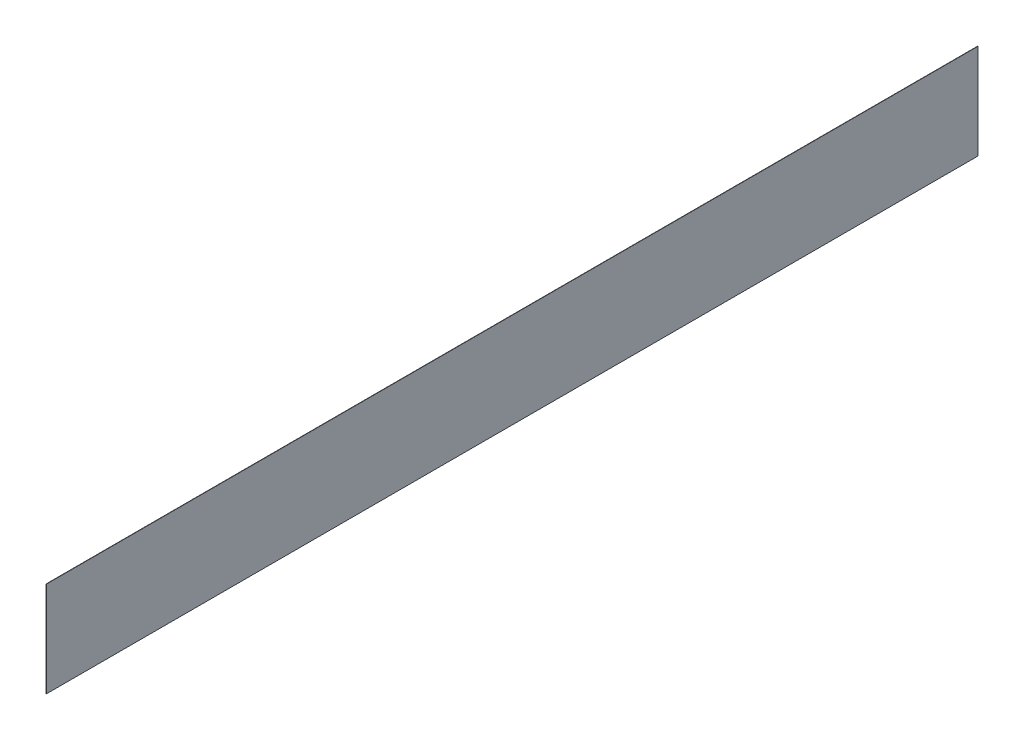
ISO-10303-21;
HEADER;
FILE_DESCRIPTION(('STEP AP214'),'2;1');
FILE_NAME('part.step','',(''),(''),'','','');
FILE_SCHEMA(('AUTOMOTIVE_DESIGN { 1 0 10303 214 1 1 1 1 }'));
ENDSEC;
DATA;
#1=APPLICATION_CONTEXT('core data for automotive mechanical design processes');
#2=APPLICATION_PROTOCOL_DEFINITION('international standard','automotive_design',2000,#1);
#3=PRODUCT_CONTEXT('',#1,'mechanical');
#4=PRODUCT('Part','Part','',(#3));
#5=PRODUCT_RELATED_PRODUCT_CATEGORY('part','',(#4));
#6=PRODUCT_DEFINITION_FORMATION('','',#4);
#7=PRODUCT_DEFINITION_CONTEXT('part definition',#1,'design');
#8=PRODUCT_DEFINITION('design','',#6,#7);
#9=PRODUCT_DEFINITION_SHAPE('','',#8);
#10=(LENGTH_UNIT() NAMED_UNIT(*) SI_UNIT(.MILLI.,.METRE.));
#11=(NAMED_UNIT(*) PLANE_ANGLE_UNIT() SI_UNIT($,.RADIAN.));
#12=(NAMED_UNIT(*) SI_UNIT($,.STERADIAN.) SOLID_ANGLE_UNIT());
#13=UNCERTAINTY_MEASURE_WITH_UNIT(LENGTH_MEASURE(1.E-05),#10,'distance_accuracy_value','');
#14=(GEOMETRIC_REPRESENTATION_CONTEXT(3) GLOBAL_UNCERTAINTY_ASSIGNED_CONTEXT((#13)) GLOBAL_UNIT_ASSIGNED_CONTEXT((#10,
#11,#12)) REPRESENTATION_CONTEXT('',''));
#15=CARTESIAN_POINT('',(0.,0.,0.));
#16=DIRECTION('',(0.,0.,1.));
#17=DIRECTION('',(1.,0.,0.));
#18=AXIS2_PLACEMENT_3D('',#15,#16,#17);
#19=CARTESIAN_POINT('',(-1.,-300.,-3768.79929063561));
#20=DIRECTION('',(0.,-1.,0.));
#21=DIRECTION('',(0.,0.,-1.));
#22=AXIS2_PLACEMENT_3D('',#19,#20,#21);
#23=PLANE('',#22);
#24=DIRECTION('',(0.,0.,-1.));
#25=VECTOR('',#24,1.);
#26=CARTESIAN_POINT('',(0.,-300.,-3768.79929063561));
#27=LINE('',#26,#25);
#28=CARTESIAN_POINT('',(0.,-300.,0.));
#29=VERTEX_POINT('',#28);
#30=CARTESIAN_POINT('',(0.,-300.,-2940.));
#31=VERTEX_POINT('',#30);
#32=EDGE_CURVE('E97',#29,#31,#27,.T.);
#33=ORIENTED_EDGE('',*,*,#32,.F.);
#34=DIRECTION('',(1.,0.,0.));
#35=VECTOR('',#34,1.);
#36=CARTESIAN_POINT('',(-1.,-300.,0.));
#37=LINE('',#36,#35);
#38=CARTESIAN_POINT('',(-1.,-300.,0.));
#39=VERTEX_POINT('',#38);
#40=EDGE_CURVE('E11',#39,#29,#37,.T.);
#41=ORIENTED_EDGE('',*,*,#40,.F.);
#42=DIRECTION('',(0.,0.,-1.));
#43=VECTOR('',#42,1.);
#44=CARTESIAN_POINT('',(-1.,-300.,-3768.79929063561));
#45=LINE('',#44,#43);
#46=CARTESIAN_POINT('',(-1.,-300.,-2940.));
#47=VERTEX_POINT('',#46);
#48=EDGE_CURVE('E91',#39,#47,#45,.T.);
#49=ORIENTED_EDGE('',*,*,#48,.T.);
#50=DIRECTION('',(1.,0.,0.));
#51=VECTOR('',#50,1.);
#52=CARTESIAN_POINT('',(-1.,-300.,-2940.));
#53=LINE('',#52,#51);
#54=EDGE_CURVE('E36',#47,#31,#53,.T.);
#55=ORIENTED_EDGE('',*,*,#54,.T.);
#56=EDGE_LOOP('',(#33,#41,#49,#55));
#57=FACE_BOUND('',#56,.T.);
#58=ADVANCED_FACE('F33',(#57),#23,.T.);
#59=CARTESIAN_POINT('',(-1.,-150.,0.));
#60=DIRECTION('',(0.,0.,1.));
#61=DIRECTION('',(0.,-1.,0.));
#62=AXIS2_PLACEMENT_3D('',#59,#60,#61);
#63=PLANE('',#62);
#64=DIRECTION('',(0.,-1.,0.));
#65=VECTOR('',#64,1.);
#66=CARTESIAN_POINT('',(0.,-150.,0.));
#67=LINE('',#66,#65);
#68=CARTESIAN_POINT('',(0.,0.,0.));
#69=VERTEX_POINT('',#68);
#70=EDGE_CURVE('E93',#69,#29,#67,.T.);
#71=ORIENTED_EDGE('',*,*,#70,.F.);
#72=DIRECTION('',(1.,0.,0.));
#73=VECTOR('',#72,1.);
#74=CARTESIAN_POINT('',(-1.,0.,0.));
#75=LINE('',#74,#73);
#76=CARTESIAN_POINT('',(-1.,0.,0.));
#77=VERTEX_POINT('',#76);
#78=EDGE_CURVE('E42',#77,#69,#75,.T.);
#79=ORIENTED_EDGE('',*,*,#78,.F.);
#80=DIRECTION('',(0.,-1.,0.));
#81=VECTOR('',#80,1.);
#82=CARTESIAN_POINT('',(-1.,-150.,0.));
#83=LINE('',#82,#81);
#84=EDGE_CURVE('E81',#77,#39,#83,.T.);
#85=ORIENTED_EDGE('',*,*,#84,.T.);
#86=ORIENTED_EDGE('',*,*,#40,.T.);
#87=EDGE_LOOP('',(#71,#79,#85,#86));
#88=FACE_BOUND('',#87,.T.);
#89=ADVANCED_FACE('F107',(#88),#63,.T.);
#90=CARTESIAN_POINT('',(-1.,0.,-3768.79929063561));
#91=DIRECTION('',(0.,-1.,0.));
#92=DIRECTION('',(0.,0.,-1.));
#93=AXIS2_PLACEMENT_3D('',#90,#91,#92);
#94=PLANE('',#93);
#95=DIRECTION('',(0.,0.,-1.));
#96=VECTOR('',#95,1.);
#97=CARTESIAN_POINT('',(0.,0.,-3768.79929063561));
#98=LINE('',#97,#96);
#99=CARTESIAN_POINT('',(0.,0.,-2940.));
#100=VERTEX_POINT('',#99);
#101=EDGE_CURVE('E86',#69,#100,#98,.T.);
#102=ORIENTED_EDGE('',*,*,#101,.T.);
#103=DIRECTION('',(1.,0.,0.));
#104=VECTOR('',#103,1.);
#105=CARTESIAN_POINT('',(-1.,0.,-2940.));
#106=LINE('',#105,#104);
#107=CARTESIAN_POINT('',(-1.,0.,-2940.));
#108=VERTEX_POINT('',#107);
#109=EDGE_CURVE('E84',#108,#100,#106,.T.);
#110=ORIENTED_EDGE('',*,*,#109,.F.);
#111=DIRECTION('',(0.,0.,-1.));
#112=VECTOR('',#111,1.);
#113=CARTESIAN_POINT('',(-1.,0.,-3768.79929063561));
#114=LINE('',#113,#112);
#115=EDGE_CURVE('E78',#77,#108,#114,.T.);
#116=ORIENTED_EDGE('',*,*,#115,.F.);
#117=ORIENTED_EDGE('',*,*,#78,.T.);
#118=EDGE_LOOP('',(#102,#110,#116,#117));
#119=FACE_BOUND('',#118,.T.);
#120=ADVANCED_FACE('F85',(#119),#94,.F.);
#121=CARTESIAN_POINT('',(-1.,-150.,-2940.));
#122=DIRECTION('',(0.,0.,1.));
#123=DIRECTION('',(1.,0.,0.));
#124=AXIS2_PLACEMENT_3D('',#121,#122,#123);
#125=PLANE('',#124);
#126=DIRECTION('',(0.,-1.,0.));
#127=VECTOR('',#126,1.);
#128=CARTESIAN_POINT('',(0.,-150.,-2940.));
#129=LINE('',#128,#127);
#130=EDGE_CURVE('E100',#100,#31,#129,.T.);
#131=ORIENTED_EDGE('',*,*,#130,.T.);
#132=ORIENTED_EDGE('',*,*,#54,.F.);
#133=DIRECTION('',(0.,-1.,0.));
#134=VECTOR('',#133,1.);
#135=CARTESIAN_POINT('',(-1.,-150.,-2940.));
#136=LINE('',#135,#134);
#137=EDGE_CURVE('E75',#108,#47,#136,.T.);
#138=ORIENTED_EDGE('',*,*,#137,.F.);
#139=ORIENTED_EDGE('',*,*,#109,.T.);
#140=EDGE_LOOP('',(#131,#132,#138,#139));
#141=FACE_BOUND('',#140,.T.);
#142=ADVANCED_FACE('F90',(#141),#125,.F.);
#143=CARTESIAN_POINT('',(-1.,-150.,-3768.79929063561));
#144=DIRECTION('',(1.,0.,0.));
#145=DIRECTION('',(0.,0.,-1.));
#146=AXIS2_PLACEMENT_3D('',#143,#144,#145);
#147=PLANE('',#146);
#148=ORIENTED_EDGE('',*,*,#48,.F.);
#149=ORIENTED_EDGE('',*,*,#84,.F.);
#150=ORIENTED_EDGE('',*,*,#115,.T.);
#151=ORIENTED_EDGE('',*,*,#137,.T.);
#152=EDGE_LOOP('',(#148,#149,#150,#151));
#153=FACE_BOUND('',#152,.T.);
#154=ADVANCED_FACE('F80',(#153),#147,.F.);
#155=CARTESIAN_POINT('',(0.,-150.,-3768.79929063561));
#156=DIRECTION('',(1.,0.,0.));
#157=DIRECTION('',(0.,0.,-1.));
#158=AXIS2_PLACEMENT_3D('',#155,#156,#157);
#159=PLANE('',#158);
#160=ORIENTED_EDGE('',*,*,#32,.T.);
#161=ORIENTED_EDGE('',*,*,#130,.F.);
#162=ORIENTED_EDGE('',*,*,#101,.F.);
#163=ORIENTED_EDGE('',*,*,#70,.T.);
#164=EDGE_LOOP('',(#160,#161,#162,#163));
#165=FACE_BOUND('',#164,.T.);
#166=ADVANCED_FACE('F106',(#165),#159,.T.);
#167=CLOSED_SHELL('',(#58,#89,#120,#142,#154,#166));
#168=MANIFOLD_SOLID_BREP('B2',#167);
#169=ADVANCED_BREP_SHAPE_REPRESENTATION('',(#18,#168),#14);
#170=SHAPE_DEFINITION_REPRESENTATION(#9,#169);
ENDSEC;
END-ISO-10303-21;
